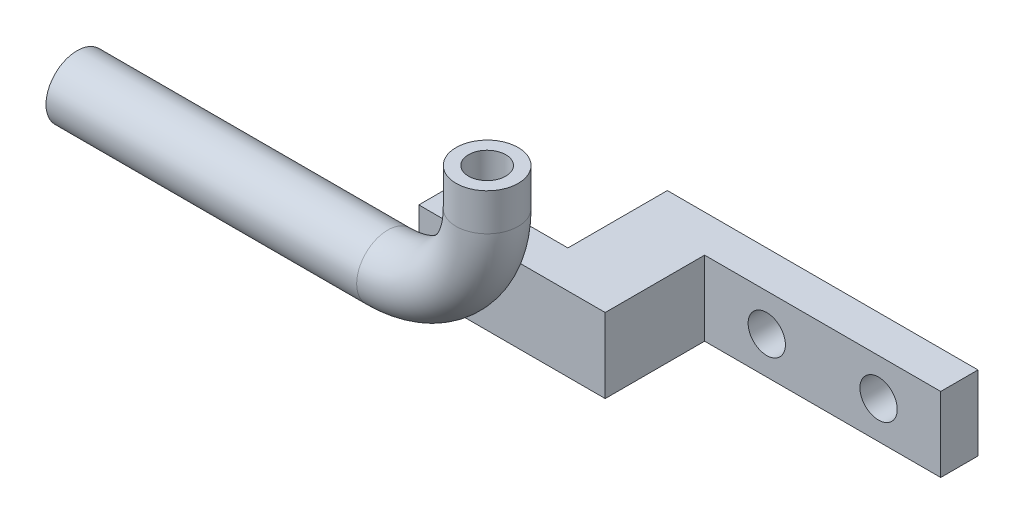
ISO-10303-21;
HEADER;
FILE_DESCRIPTION(('STEP AP214'),'2;1');
FILE_NAME('part.step','',(''),(''),'','','');
FILE_SCHEMA(('AUTOMOTIVE_DESIGN { 1 0 10303 214 1 1 1 1 }'));
ENDSEC;
DATA;
#1=APPLICATION_CONTEXT('core data for automotive mechanical design processes');
#2=APPLICATION_PROTOCOL_DEFINITION('international standard','automotive_design',2000,#1);
#3=PRODUCT_CONTEXT('',#1,'mechanical');
#4=PRODUCT('Part','Part','',(#3));
#5=PRODUCT_RELATED_PRODUCT_CATEGORY('part','',(#4));
#6=PRODUCT_DEFINITION_FORMATION('','',#4);
#7=PRODUCT_DEFINITION_CONTEXT('part definition',#1,'design');
#8=PRODUCT_DEFINITION('design','',#6,#7);
#9=PRODUCT_DEFINITION_SHAPE('','',#8);
#10=(LENGTH_UNIT() NAMED_UNIT(*) SI_UNIT(.MILLI.,.METRE.));
#11=(NAMED_UNIT(*) PLANE_ANGLE_UNIT() SI_UNIT($,.RADIAN.));
#12=(NAMED_UNIT(*) SI_UNIT($,.STERADIAN.) SOLID_ANGLE_UNIT());
#13=UNCERTAINTY_MEASURE_WITH_UNIT(LENGTH_MEASURE(1.E-05),#10,'distance_accuracy_value','');
#14=(GEOMETRIC_REPRESENTATION_CONTEXT(3) GLOBAL_UNCERTAINTY_ASSIGNED_CONTEXT((#13)) GLOBAL_UNIT_ASSIGNED_CONTEXT((#10,
#11,#12)) REPRESENTATION_CONTEXT('',''));
#15=CARTESIAN_POINT('',(0.,0.,0.));
#16=DIRECTION('',(0.,0.,1.));
#17=DIRECTION('',(1.,0.,0.));
#18=AXIS2_PLACEMENT_3D('',#15,#16,#17);
#19=CARTESIAN_POINT('',(-35.701435552391,33.5630206808068,-5.5));
#20=DIRECTION('',(1.,0.,0.));
#21=DIRECTION('',(0.,0.,-1.));
#22=AXIS2_PLACEMENT_3D('',#19,#20,#21);
#23=PLANE('',#22);
#24=DIRECTION('',(0.,1.,0.));
#25=VECTOR('',#24,1.);
#26=CARTESIAN_POINT('',(-35.701435552391,33.5630206808068,-2.5));
#27=LINE('',#26,#25);
#28=CARTESIAN_POINT('',(-35.701435552391,27.5630206808068,-2.5));
#29=VERTEX_POINT('',#28);
#30=CARTESIAN_POINT('',(-35.701435552391,33.5630206808068,-2.5));
#31=VERTEX_POINT('',#30);
#32=EDGE_CURVE('E147',#29,#31,#27,.T.);
#33=ORIENTED_EDGE('',*,*,#32,.T.);
#34=DIRECTION('',(0.,0.,1.));
#35=VECTOR('',#34,1.);
#36=CARTESIAN_POINT('',(-35.701435552391,33.5630206808068,-5.5));
#37=LINE('',#36,#35);
#38=CARTESIAN_POINT('',(-35.701435552391,33.5630206808068,-5.5));
#39=VERTEX_POINT('',#38);
#40=EDGE_CURVE('E12',#39,#31,#37,.T.);
#41=ORIENTED_EDGE('',*,*,#40,.F.);
#42=DIRECTION('',(0.,1.,0.));
#43=VECTOR('',#42,1.);
#44=CARTESIAN_POINT('',(-35.701435552391,33.5630206808068,-5.5));
#45=LINE('',#44,#43);
#46=CARTESIAN_POINT('',(-35.701435552391,27.5630206808068,-5.5));
#47=VERTEX_POINT('',#46);
#48=EDGE_CURVE('E148',#47,#39,#45,.T.);
#49=ORIENTED_EDGE('',*,*,#48,.F.);
#50=DIRECTION('',(0.,0.,1.));
#51=VECTOR('',#50,1.);
#52=CARTESIAN_POINT('',(-35.701435552391,27.5630206808068,-5.5));
#53=LINE('',#52,#51);
#54=EDGE_CURVE('E157',#47,#29,#53,.T.);
#55=ORIENTED_EDGE('',*,*,#54,.T.);
#56=EDGE_LOOP('',(#33,#41,#49,#55));
#57=FACE_BOUND('',#56,.T.);
#58=ADVANCED_FACE('F40',(#57),#23,.F.);
#59=CARTESIAN_POINT('',(-35.701435552391,33.5630206808068,-5.5));
#60=DIRECTION('',(0.,-1.,0.));
#61=DIRECTION('',(1.,0.,0.));
#62=AXIS2_PLACEMENT_3D('',#59,#60,#61);
#63=PLANE('',#62);
#64=DIRECTION('',(0.,0.,1.));
#65=VECTOR('',#64,1.);
#66=CARTESIAN_POINT('',(-20.701435552391,33.5630206808068,-5.5));
#67=LINE('',#66,#65);
#68=CARTESIAN_POINT('',(-20.701435552391,33.5630206808068,-10.5));
#69=VERTEX_POINT('',#68);
#70=CARTESIAN_POINT('',(-20.701435552391,33.5630206808068,-2.5));
#71=VERTEX_POINT('',#70);
#72=EDGE_CURVE('E47',#69,#71,#67,.T.);
#73=ORIENTED_EDGE('',*,*,#72,.F.);
#74=DIRECTION('',(1.,0.,0.));
#75=VECTOR('',#74,1.);
#76=CARTESIAN_POINT('',(-26.701435552391,33.5630206808068,-10.5));
#77=LINE('',#76,#75);
#78=CARTESIAN_POINT('',(-1.701435552391,33.5630206808068,-10.5));
#79=VERTEX_POINT('',#78);
#80=EDGE_CURVE('E102',#69,#79,#77,.T.);
#81=ORIENTED_EDGE('',*,*,#80,.T.);
#82=DIRECTION('',(0.,0.,-1.));
#83=VECTOR('',#82,1.);
#84=CARTESIAN_POINT('',(-1.701435552391,33.5630206808068,-10.5));
#85=LINE('',#84,#83);
#86=CARTESIAN_POINT('',(-1.701435552391,33.5630206808068,-13.5));
#87=VERTEX_POINT('',#86);
#88=EDGE_CURVE('E106',#79,#87,#85,.T.);
#89=ORIENTED_EDGE('',*,*,#88,.T.);
#90=DIRECTION('',(-1.,0.,0.));
#91=VECTOR('',#90,1.);
#92=CARTESIAN_POINT('',(-20.701435552391,33.5630206808068,-13.5));
#93=LINE('',#92,#91);
#94=CARTESIAN_POINT('',(-26.701435552391,33.5630206808068,-13.5));
#95=VERTEX_POINT('',#94);
#96=EDGE_CURVE('E133',#87,#95,#93,.T.);
#97=ORIENTED_EDGE('',*,*,#96,.T.);
#98=DIRECTION('',(0.,0.,1.));
#99=VECTOR('',#98,1.);
#100=CARTESIAN_POINT('',(-26.701435552391,33.5630206808068,-13.5));
#101=LINE('',#100,#99);
#102=CARTESIAN_POINT('',(-26.701435552391,33.5630206808068,-5.5));
#103=VERTEX_POINT('',#102);
#104=EDGE_CURVE('E140',#95,#103,#101,.T.);
#105=ORIENTED_EDGE('',*,*,#104,.T.);
#106=DIRECTION('',(1.,0.,0.));
#107=VECTOR('',#106,1.);
#108=CARTESIAN_POINT('',(-35.701435552391,33.5630206808068,-5.5));
#109=LINE('',#108,#107);
#110=EDGE_CURVE('E151',#39,#103,#109,.T.);
#111=ORIENTED_EDGE('',*,*,#110,.F.);
#112=ORIENTED_EDGE('',*,*,#40,.T.);
#113=DIRECTION('',(1.,0.,0.));
#114=VECTOR('',#113,1.);
#115=CARTESIAN_POINT('',(-35.701435552391,33.5630206808068,-2.5));
#116=LINE('',#115,#114);
#117=EDGE_CURVE('E160',#31,#71,#116,.T.);
#118=ORIENTED_EDGE('',*,*,#117,.T.);
#119=EDGE_LOOP('',(#73,#81,#89,#97,#105,#111,#112,#118));
#120=FACE_BOUND('',#119,.T.);
#121=ADVANCED_FACE('F104',(#120),#63,.F.);
#122=CARTESIAN_POINT('',(-20.701435552391,33.5630206808068,-5.5));
#123=DIRECTION('',(-1.,0.,0.));
#124=DIRECTION('',(0.,0.,1.));
#125=AXIS2_PLACEMENT_3D('',#122,#123,#124);
#126=PLANE('',#125);
#127=DIRECTION('',(0.,0.,1.));
#128=VECTOR('',#127,1.);
#129=CARTESIAN_POINT('',(-20.701435552391,27.5630206808068,-5.5));
#130=LINE('',#129,#128);
#131=CARTESIAN_POINT('',(-20.701435552391,27.5630206808068,-10.5));
#132=VERTEX_POINT('',#131);
#133=CARTESIAN_POINT('',(-20.701435552391,27.5630206808068,-2.5));
#134=VERTEX_POINT('',#133);
#135=EDGE_CURVE('E59',#132,#134,#130,.T.);
#136=ORIENTED_EDGE('',*,*,#135,.F.);
#137=DIRECTION('',(0.,1.,0.));
#138=VECTOR('',#137,1.);
#139=CARTESIAN_POINT('',(-20.701435552391,33.5630206808068,-10.5));
#140=LINE('',#139,#138);
#141=EDGE_CURVE('E54',#132,#69,#140,.T.);
#142=ORIENTED_EDGE('',*,*,#141,.T.);
#143=ORIENTED_EDGE('',*,*,#72,.T.);
#144=DIRECTION('',(0.,-1.,0.));
#145=VECTOR('',#144,1.);
#146=CARTESIAN_POINT('',(-20.701435552391,33.5630206808068,-2.5));
#147=LINE('',#146,#145);
#148=EDGE_CURVE('E162',#71,#134,#147,.T.);
#149=ORIENTED_EDGE('',*,*,#148,.T.);
#150=EDGE_LOOP('',(#136,#142,#143,#149));
#151=FACE_BOUND('',#150,.T.);
#152=ADVANCED_FACE('F167',(#151),#126,.F.);
#153=CARTESIAN_POINT('',(-35.701435552391,27.5630206808068,-5.5));
#154=DIRECTION('',(0.,1.,0.));
#155=DIRECTION('',(-1.,0.,0.));
#156=AXIS2_PLACEMENT_3D('',#153,#154,#155);
#157=PLANE('',#156);
#158=DIRECTION('',(-1.,0.,0.));
#159=VECTOR('',#158,1.);
#160=CARTESIAN_POINT('',(-35.701435552391,27.5630206808068,-5.5));
#161=LINE('',#160,#159);
#162=CARTESIAN_POINT('',(-26.701435552391,27.5630206808068,-5.5));
#163=VERTEX_POINT('',#162);
#164=EDGE_CURVE('E155',#163,#47,#161,.T.);
#165=ORIENTED_EDGE('',*,*,#164,.F.);
#166=DIRECTION('',(0.,0.,1.));
#167=VECTOR('',#166,1.);
#168=CARTESIAN_POINT('',(-26.701435552391,27.5630206808068,-13.5));
#169=LINE('',#168,#167);
#170=CARTESIAN_POINT('',(-26.701435552391,27.5630206808068,-13.5));
#171=VERTEX_POINT('',#170);
#172=EDGE_CURVE('E141',#171,#163,#169,.T.);
#173=ORIENTED_EDGE('',*,*,#172,.F.);
#174=DIRECTION('',(1.,0.,0.));
#175=VECTOR('',#174,1.);
#176=CARTESIAN_POINT('',(-20.701435552391,27.5630206808068,-13.5));
#177=LINE('',#176,#175);
#178=CARTESIAN_POINT('',(-1.701435552391,27.5630206808068,-13.5));
#179=VERTEX_POINT('',#178);
#180=EDGE_CURVE('E138',#171,#179,#177,.T.);
#181=ORIENTED_EDGE('',*,*,#180,.T.);
#182=DIRECTION('',(0.,0.,-1.));
#183=VECTOR('',#182,1.);
#184=CARTESIAN_POINT('',(-1.701435552391,27.5630206808068,-10.5));
#185=LINE('',#184,#183);
#186=CARTESIAN_POINT('',(-1.701435552391,27.5630206808068,-10.5));
#187=VERTEX_POINT('',#186);
#188=EDGE_CURVE('E120',#187,#179,#185,.T.);
#189=ORIENTED_EDGE('',*,*,#188,.F.);
#190=DIRECTION('',(-1.,0.,0.));
#191=VECTOR('',#190,1.);
#192=CARTESIAN_POINT('',(-26.701435552391,27.5630206808068,-10.5));
#193=LINE('',#192,#191);
#194=EDGE_CURVE('E121',#187,#132,#193,.T.);
#195=ORIENTED_EDGE('',*,*,#194,.T.);
#196=ORIENTED_EDGE('',*,*,#135,.T.);
#197=DIRECTION('',(-1.,0.,0.));
#198=VECTOR('',#197,1.);
#199=CARTESIAN_POINT('',(-35.701435552391,27.5630206808068,-2.5));
#200=LINE('',#199,#198);
#201=EDGE_CURVE('E152',#134,#29,#200,.T.);
#202=ORIENTED_EDGE('',*,*,#201,.T.);
#203=ORIENTED_EDGE('',*,*,#54,.F.);
#204=EDGE_LOOP('',(#165,#173,#181,#189,#195,#196,#202,#203));
#205=FACE_BOUND('',#204,.T.);
#206=ADVANCED_FACE('F177',(#205),#157,.F.);
#207=CARTESIAN_POINT('',(-35.701435552391,27.5630206808068,-5.5));
#208=DIRECTION('',(0.,0.,1.));
#209=DIRECTION('',(1.,0.,0.));
#210=AXIS2_PLACEMENT_3D('',#207,#208,#209);
#211=PLANE('',#210);
#212=ORIENTED_EDGE('',*,*,#110,.T.);
#213=DIRECTION('',(0.,-1.,0.));
#214=VECTOR('',#213,1.);
#215=CARTESIAN_POINT('',(-26.701435552391,27.5630206808068,-5.5));
#216=LINE('',#215,#214);
#217=EDGE_CURVE('E143',#103,#163,#216,.T.);
#218=ORIENTED_EDGE('',*,*,#217,.T.);
#219=ORIENTED_EDGE('',*,*,#164,.T.);
#220=ORIENTED_EDGE('',*,*,#48,.T.);
#221=EDGE_LOOP('',(#212,#218,#219,#220));
#222=FACE_BOUND('',#221,.T.);
#223=ADVANCED_FACE('F181',(#222),#211,.F.);
#224=CARTESIAN_POINT('',(-35.701435552391,27.5630206808068,-2.5));
#225=DIRECTION('',(0.,0.,1.));
#226=DIRECTION('',(1.,0.,0.));
#227=AXIS2_PLACEMENT_3D('',#224,#225,#226);
#228=PLANE('',#227);
#229=ORIENTED_EDGE('',*,*,#32,.F.);
#230=ORIENTED_EDGE('',*,*,#201,.F.);
#231=ORIENTED_EDGE('',*,*,#148,.F.);
#232=ORIENTED_EDGE('',*,*,#117,.F.);
#233=EDGE_LOOP('',(#229,#230,#231,#232));
#234=FACE_BOUND('',#233,.T.);
#235=ADVANCED_FACE('F173',(#234),#228,.T.);
#236=CARTESIAN_POINT('',(-26.701435552391,27.5630206808068,-13.5));
#237=DIRECTION('',(-1.,0.,0.));
#238=DIRECTION('',(0.,0.,1.));
#239=AXIS2_PLACEMENT_3D('',#236,#237,#238);
#240=PLANE('',#239);
#241=ORIENTED_EDGE('',*,*,#217,.F.);
#242=ORIENTED_EDGE('',*,*,#104,.F.);
#243=DIRECTION('',(0.,-1.,0.));
#244=VECTOR('',#243,1.);
#245=CARTESIAN_POINT('',(-26.701435552391,27.5630206808068,-13.5));
#246=LINE('',#245,#244);
#247=EDGE_CURVE('E135',#95,#171,#246,.T.);
#248=ORIENTED_EDGE('',*,*,#247,.T.);
#249=ORIENTED_EDGE('',*,*,#172,.T.);
#250=EDGE_LOOP('',(#241,#242,#248,#249));
#251=FACE_BOUND('',#250,.T.);
#252=ADVANCED_FACE('F186',(#251),#240,.T.);
#253=CARTESIAN_POINT('',(-20.701435552391,33.5630206808068,-13.5));
#254=DIRECTION('',(0.,0.,1.));
#255=DIRECTION('',(1.,0.,0.));
#256=AXIS2_PLACEMENT_3D('',#253,#254,#255);
#257=PLANE('',#256);
#258=CARTESIAN_POINT('',(-6.701435552391,30.5630206808068,-13.5));
#259=DIRECTION('',(0.,0.,1.));
#260=DIRECTION('',(1.,0.,0.));
#261=AXIS2_PLACEMENT_3D('',#258,#259,#260);
#262=CIRCLE('',#261,1.5);
#263=CARTESIAN_POINT('',(-5.201435552391,30.5630206808068,-13.5));
#264=VERTEX_POINT('',#263);
#265=EDGE_CURVE('E276',#264,#264,#262,.T.);
#266=ORIENTED_EDGE('',*,*,#265,.T.);
#267=EDGE_LOOP('',(#266));
#268=FACE_BOUND('',#267,.T.);
#269=CARTESIAN_POINT('',(-15.701435552391,30.5630206808068,-13.5));
#270=DIRECTION('',(0.,0.,1.));
#271=DIRECTION('',(1.,0.,0.));
#272=AXIS2_PLACEMENT_3D('',#269,#270,#271);
#273=CIRCLE('',#272,1.5);
#274=CARTESIAN_POINT('',(-14.201435552391,30.5630206808068,-13.5));
#275=VERTEX_POINT('',#274);
#276=EDGE_CURVE('E130',#275,#275,#273,.T.);
#277=ORIENTED_EDGE('',*,*,#276,.T.);
#278=EDGE_LOOP('',(#277));
#279=FACE_BOUND('',#278,.T.);
#280=ORIENTED_EDGE('',*,*,#96,.F.);
#281=DIRECTION('',(0.,-1.,0.));
#282=VECTOR('',#281,1.);
#283=CARTESIAN_POINT('',(-1.701435552391,33.5630206808068,-13.5));
#284=LINE('',#283,#282);
#285=EDGE_CURVE('E112',#87,#179,#284,.T.);
#286=ORIENTED_EDGE('',*,*,#285,.T.);
#287=ORIENTED_EDGE('',*,*,#180,.F.);
#288=ORIENTED_EDGE('',*,*,#247,.F.);
#289=EDGE_LOOP('',(#280,#286,#287,#288));
#290=FACE_BOUND('',#289,.T.);
#291=ADVANCED_FACE('F188',(#268,#279,#290),#257,.F.);
#292=CARTESIAN_POINT('',(-26.701435552391,27.5630206808068,-10.5));
#293=DIRECTION('',(0.,0.,1.));
#294=DIRECTION('',(1.,0.,0.));
#295=AXIS2_PLACEMENT_3D('',#292,#293,#294);
#296=PLANE('',#295);
#297=CARTESIAN_POINT('',(-6.701435552391,30.5630206808068,-10.5));
#298=DIRECTION('',(0.,0.,1.));
#299=DIRECTION('',(1.,0.,0.));
#300=AXIS2_PLACEMENT_3D('',#297,#298,#299);
#301=CIRCLE('',#300,1.5);
#302=CARTESIAN_POINT('',(-5.201435552391,30.5630206808068,-10.5));
#303=VERTEX_POINT('',#302);
#304=EDGE_CURVE('E279',#303,#303,#301,.T.);
#305=ORIENTED_EDGE('',*,*,#304,.F.);
#306=EDGE_LOOP('',(#305));
#307=FACE_BOUND('',#306,.T.);
#308=CARTESIAN_POINT('',(-15.701435552391,30.5630206808068,-10.5));
#309=DIRECTION('',(0.,0.,1.));
#310=DIRECTION('',(1.,0.,0.));
#311=AXIS2_PLACEMENT_3D('',#308,#309,#310);
#312=CIRCLE('',#311,1.5);
#313=CARTESIAN_POINT('',(-14.201435552391,30.5630206808068,-10.5));
#314=VERTEX_POINT('',#313);
#315=EDGE_CURVE('E281',#314,#314,#312,.T.);
#316=ORIENTED_EDGE('',*,*,#315,.F.);
#317=EDGE_LOOP('',(#316));
#318=FACE_BOUND('',#317,.T.);
#319=ORIENTED_EDGE('',*,*,#141,.F.);
#320=ORIENTED_EDGE('',*,*,#194,.F.);
#321=DIRECTION('',(0.,-1.,0.));
#322=VECTOR('',#321,1.);
#323=CARTESIAN_POINT('',(-1.701435552391,33.5630206808068,-10.5));
#324=LINE('',#323,#322);
#325=EDGE_CURVE('E111',#79,#187,#324,.T.);
#326=ORIENTED_EDGE('',*,*,#325,.F.);
#327=ORIENTED_EDGE('',*,*,#80,.F.);
#328=EDGE_LOOP('',(#319,#320,#326,#327));
#329=FACE_BOUND('',#328,.T.);
#330=ADVANCED_FACE('F123',(#307,#318,#329),#296,.T.);
#331=CARTESIAN_POINT('',(-1.701435552391,33.5630206808068,-10.5));
#332=DIRECTION('',(1.,0.,0.));
#333=DIRECTION('',(0.,1.,0.));
#334=AXIS2_PLACEMENT_3D('',#331,#332,#333);
#335=PLANE('',#334);
#336=ORIENTED_EDGE('',*,*,#285,.F.);
#337=ORIENTED_EDGE('',*,*,#88,.F.);
#338=ORIENTED_EDGE('',*,*,#325,.T.);
#339=ORIENTED_EDGE('',*,*,#188,.T.);
#340=EDGE_LOOP('',(#336,#337,#338,#339));
#341=FACE_BOUND('',#340,.T.);
#342=ADVANCED_FACE('F116',(#341),#335,.T.);
#343=CARTESIAN_POINT('',(-15.701435552391,30.5630206808068,-13.5));
#344=DIRECTION('',(0.,0.,1.));
#345=DIRECTION('',(1.,0.,0.));
#346=AXIS2_PLACEMENT_3D('',#343,#344,#345);
#347=CYLINDRICAL_SURFACE('',#346,1.5);
#348=ORIENTED_EDGE('',*,*,#276,.F.);
#349=EDGE_LOOP('',(#348));
#350=FACE_BOUND('',#349,.T.);
#351=ORIENTED_EDGE('',*,*,#315,.T.);
#352=EDGE_LOOP('',(#351));
#353=FACE_BOUND('',#352,.T.);
#354=ADVANCED_FACE('F241',(#350,#353),#347,.F.);
#355=CARTESIAN_POINT('',(-6.701435552391,30.5630206808068,-13.5));
#356=DIRECTION('',(0.,0.,1.));
#357=DIRECTION('',(1.,0.,0.));
#358=AXIS2_PLACEMENT_3D('',#355,#356,#357);
#359=CYLINDRICAL_SURFACE('',#358,1.5);
#360=ORIENTED_EDGE('',*,*,#265,.F.);
#361=EDGE_LOOP('',(#360));
#362=FACE_BOUND('',#361,.T.);
#363=ORIENTED_EDGE('',*,*,#304,.T.);
#364=EDGE_LOOP('',(#363));
#365=FACE_BOUND('',#364,.T.);
#366=ADVANCED_FACE('F260',(#362,#365),#359,.F.);
#367=CLOSED_SHELL('',(#58,#121,#152,#206,#223,#235,#252,#291,#330,#342,#354,#366));
#368=MANIFOLD_SOLID_BREP('B2',#367);
#369=CARTESIAN_POINT('',(-35.701435552391,30.5630206808068,0.));
#370=DIRECTION('',(-1.,0.,0.));
#371=DIRECTION('',(0.,0.,1.));
#372=AXIS2_PLACEMENT_3D('',#369,#370,#371);
#373=CYLINDRICAL_SURFACE('',#372,2.5);
#374=CARTESIAN_POINT('',(-35.701435552391,30.5630206808068,0.));
#375=DIRECTION('',(1.,0.,0.));
#376=DIRECTION('',(0.,0.,1.));
#377=AXIS2_PLACEMENT_3D('',#374,#375,#376);
#378=CIRCLE('',#377,2.5);
#379=CARTESIAN_POINT('',(-35.701435552391,28.0630206808068,0.));
#380=VERTEX_POINT('',#379);
#381=EDGE_CURVE('E337',#380,#380,#378,.T.);
#382=ORIENTED_EDGE('',*,*,#381,.F.);
#383=EDGE_LOOP('',(#382));
#384=FACE_BOUND('',#383,.T.);
#385=CARTESIAN_POINT('',(-60.701435552391,30.5630206808068,0.));
#386=DIRECTION('',(1.,0.,0.));
#387=DIRECTION('',(0.,0.,1.));
#388=AXIS2_PLACEMENT_3D('',#385,#386,#387);
#389=CIRCLE('',#388,2.5);
#390=CARTESIAN_POINT('',(-60.701435552391,30.5630206808068,2.5));
#391=VERTEX_POINT('',#390);
#392=EDGE_CURVE('E39',#391,#391,#389,.T.);
#393=ORIENTED_EDGE('',*,*,#392,.T.);
#394=EDGE_LOOP('',(#393));
#395=FACE_BOUND('',#394,.T.);
#396=ADVANCED_FACE('F327',(#384,#395),#373,.T.);
#397=CARTESIAN_POINT('',(-35.701435552391,30.5630206808068,0.));
#398=DIRECTION('',(-1.,0.,0.));
#399=DIRECTION('',(0.,0.,1.));
#400=AXIS2_PLACEMENT_3D('',#397,#398,#399);
#401=CYLINDRICAL_SURFACE('',#400,1.5);
#402=CARTESIAN_POINT('',(-35.701435552391,30.5630206808068,0.));
#403=DIRECTION('',(1.,0.,0.));
#404=DIRECTION('',(0.,0.,1.));
#405=AXIS2_PLACEMENT_3D('',#402,#403,#404);
#406=CIRCLE('',#405,1.5);
#407=CARTESIAN_POINT('',(-35.701435552391,29.0630206808068,0.));
#408=VERTEX_POINT('',#407);
#409=EDGE_CURVE('E341',#408,#408,#406,.T.);
#410=ORIENTED_EDGE('',*,*,#409,.T.);
#411=EDGE_LOOP('',(#410));
#412=FACE_BOUND('',#411,.T.);
#413=CARTESIAN_POINT('',(-60.701435552391,30.5630206808068,0.));
#414=DIRECTION('',(1.,0.,0.));
#415=DIRECTION('',(0.,0.,1.));
#416=AXIS2_PLACEMENT_3D('',#413,#414,#415);
#417=CIRCLE('',#416,1.5);
#418=CARTESIAN_POINT('',(-60.701435552391,30.5630206808068,1.5));
#419=VERTEX_POINT('',#418);
#420=EDGE_CURVE('E333',#419,#419,#417,.T.);
#421=ORIENTED_EDGE('',*,*,#420,.F.);
#422=EDGE_LOOP('',(#421));
#423=FACE_BOUND('',#422,.T.);
#424=ADVANCED_FACE('F384',(#412,#423),#401,.F.);
#425=CARTESIAN_POINT('',(-35.701435552391,38.5630206808068,0.));
#426=DIRECTION('',(0.,0.,-1.));
#427=DIRECTION('',(-1.,0.,0.));
#428=AXIS2_PLACEMENT_3D('',#425,#426,#427);
#429=TOROIDAL_SURFACE('',#428,8.,2.5);
#430=CARTESIAN_POINT('',(-27.701435552391,38.5630206808068,0.));
#431=DIRECTION('',(0.,1.,0.));
#432=DIRECTION('',(0.,0.,1.));
#433=AXIS2_PLACEMENT_3D('',#430,#431,#432);
#434=CIRCLE('',#433,2.5);
#435=CARTESIAN_POINT('',(-25.201435552391,38.5630206808068,0.));
#436=VERTEX_POINT('',#435);
#437=EDGE_CURVE('E346',#436,#436,#434,.T.);
#438=CARTESIAN_POINT('',(-35.701435552391,38.5630206808068,0.));
#439=DIRECTION('',(0.,0.,-1.));
#440=DIRECTION('',(-1.,0.,0.));
#441=AXIS2_PLACEMENT_3D('',#438,#439,#440);
#442=CIRCLE('',#441,10.5);
#443=EDGE_CURVE('',#436,#380,#442,.T.);
#444=ORIENTED_EDGE('',*,*,#437,.F.);
#445=ORIENTED_EDGE('',*,*,#381,.T.);
#446=ORIENTED_EDGE('',*,*,#443,.T.);
#447=ORIENTED_EDGE('',*,*,#443,.F.);
#448=EDGE_LOOP('',(#444,#446,#445,#447));
#449=FACE_BOUND('',#448,.T.);
#450=ADVANCED_FACE('F389',(#449),#429,.T.);
#451=CARTESIAN_POINT('',(-35.701435552391,38.5630206808068,0.));
#452=DIRECTION('',(0.,0.,-1.));
#453=DIRECTION('',(-1.,0.,0.));
#454=AXIS2_PLACEMENT_3D('',#451,#452,#453);
#455=TOROIDAL_SURFACE('',#454,8.,1.5);
#456=CARTESIAN_POINT('',(-27.701435552391,38.5630206808068,0.));
#457=DIRECTION('',(0.,1.,0.));
#458=DIRECTION('',(0.,0.,1.));
#459=AXIS2_PLACEMENT_3D('',#456,#457,#458);
#460=CIRCLE('',#459,1.5);
#461=CARTESIAN_POINT('',(-26.201435552391,38.5630206808068,0.));
#462=VERTEX_POINT('',#461);
#463=EDGE_CURVE('E350',#462,#462,#460,.T.);
#464=CARTESIAN_POINT('',(-35.701435552391,38.5630206808068,0.));
#465=DIRECTION('',(0.,0.,-1.));
#466=DIRECTION('',(-1.,0.,0.));
#467=AXIS2_PLACEMENT_3D('',#464,#465,#466);
#468=CIRCLE('',#467,9.5);
#469=EDGE_CURVE('',#462,#408,#468,.T.);
#470=ORIENTED_EDGE('',*,*,#463,.T.);
#471=ORIENTED_EDGE('',*,*,#409,.F.);
#472=ORIENTED_EDGE('',*,*,#469,.T.);
#473=ORIENTED_EDGE('',*,*,#469,.F.);
#474=EDGE_LOOP('',(#470,#472,#471,#473));
#475=FACE_BOUND('',#474,.T.);
#476=ADVANCED_FACE('F359',(#475),#455,.F.);
#477=CARTESIAN_POINT('',(-27.701435552391,38.5630206808068,0.));
#478=DIRECTION('',(0.,1.,0.));
#479=DIRECTION('',(-1.,0.,0.));
#480=AXIS2_PLACEMENT_3D('',#477,#478,#479);
#481=CYLINDRICAL_SURFACE('',#480,1.5);
#482=ORIENTED_EDGE('',*,*,#463,.F.);
#483=EDGE_LOOP('',(#482));
#484=FACE_BOUND('',#483,.T.);
#485=CARTESIAN_POINT('',(-27.701435552391,41.5630206808068,0.));
#486=DIRECTION('',(0.,1.,0.));
#487=DIRECTION('',(0.,0.,1.));
#488=AXIS2_PLACEMENT_3D('',#485,#486,#487);
#489=CIRCLE('',#488,1.5);
#490=CARTESIAN_POINT('',(-27.701435552391,41.5630206808068,1.5));
#491=VERTEX_POINT('',#490);
#492=EDGE_CURVE('E351',#491,#491,#489,.T.);
#493=ORIENTED_EDGE('',*,*,#492,.T.);
#494=EDGE_LOOP('',(#493));
#495=FACE_BOUND('',#494,.T.);
#496=ADVANCED_FACE('F362',(#484,#495),#481,.F.);
#497=CARTESIAN_POINT('',(-27.701435552391,38.5630206808068,0.));
#498=DIRECTION('',(0.,1.,0.));
#499=DIRECTION('',(-1.,0.,0.));
#500=AXIS2_PLACEMENT_3D('',#497,#498,#499);
#501=CYLINDRICAL_SURFACE('',#500,2.5);
#502=ORIENTED_EDGE('',*,*,#437,.T.);
#503=EDGE_LOOP('',(#502));
#504=FACE_BOUND('',#503,.T.);
#505=CARTESIAN_POINT('',(-27.701435552391,41.5630206808068,0.));
#506=DIRECTION('',(0.,1.,0.));
#507=DIRECTION('',(0.,0.,1.));
#508=AXIS2_PLACEMENT_3D('',#505,#506,#507);
#509=CIRCLE('',#508,2.5);
#510=CARTESIAN_POINT('',(-27.701435552391,41.5630206808068,2.5));
#511=VERTEX_POINT('',#510);
#512=EDGE_CURVE('E347',#511,#511,#509,.T.);
#513=ORIENTED_EDGE('',*,*,#512,.F.);
#514=EDGE_LOOP('',(#513));
#515=FACE_BOUND('',#514,.T.);
#516=ADVANCED_FACE('F365',(#504,#515),#501,.T.);
#517=CARTESIAN_POINT('',(-60.701435552391,30.5630206808068,0.));
#518=DIRECTION('',(1.,0.,0.));
#519=DIRECTION('',(0.,0.,1.));
#520=AXIS2_PLACEMENT_3D('',#517,#518,#519);
#521=PLANE('',#520);
#522=ORIENTED_EDGE('',*,*,#420,.T.);
#523=EDGE_LOOP('',(#522));
#524=FACE_BOUND('',#523,.T.);
#525=ORIENTED_EDGE('',*,*,#392,.F.);
#526=EDGE_LOOP('',(#525));
#527=FACE_BOUND('',#526,.T.);
#528=ADVANCED_FACE('F372',(#524,#527),#521,.F.);
#529=CARTESIAN_POINT('',(-27.701435552391,41.5630206808068,0.));
#530=DIRECTION('',(0.,1.,0.));
#531=DIRECTION('',(0.,0.,1.));
#532=AXIS2_PLACEMENT_3D('',#529,#530,#531);
#533=PLANE('',#532);
#534=ORIENTED_EDGE('',*,*,#492,.F.);
#535=EDGE_LOOP('',(#534));
#536=FACE_BOUND('',#535,.T.);
#537=ORIENTED_EDGE('',*,*,#512,.T.);
#538=EDGE_LOOP('',(#537));
#539=FACE_BOUND('',#538,.T.);
#540=ADVANCED_FACE('F369',(#536,#539),#533,.T.);
#541=CLOSED_SHELL('',(#396,#424,#450,#476,#496,#516,#528,#540));
#542=MANIFOLD_SOLID_BREP('B6',#541);
#543=ADVANCED_BREP_SHAPE_REPRESENTATION('',(#18,#368,#542),#14);
#544=SHAPE_DEFINITION_REPRESENTATION(#9,#543);
ENDSEC;
END-ISO-10303-21;
